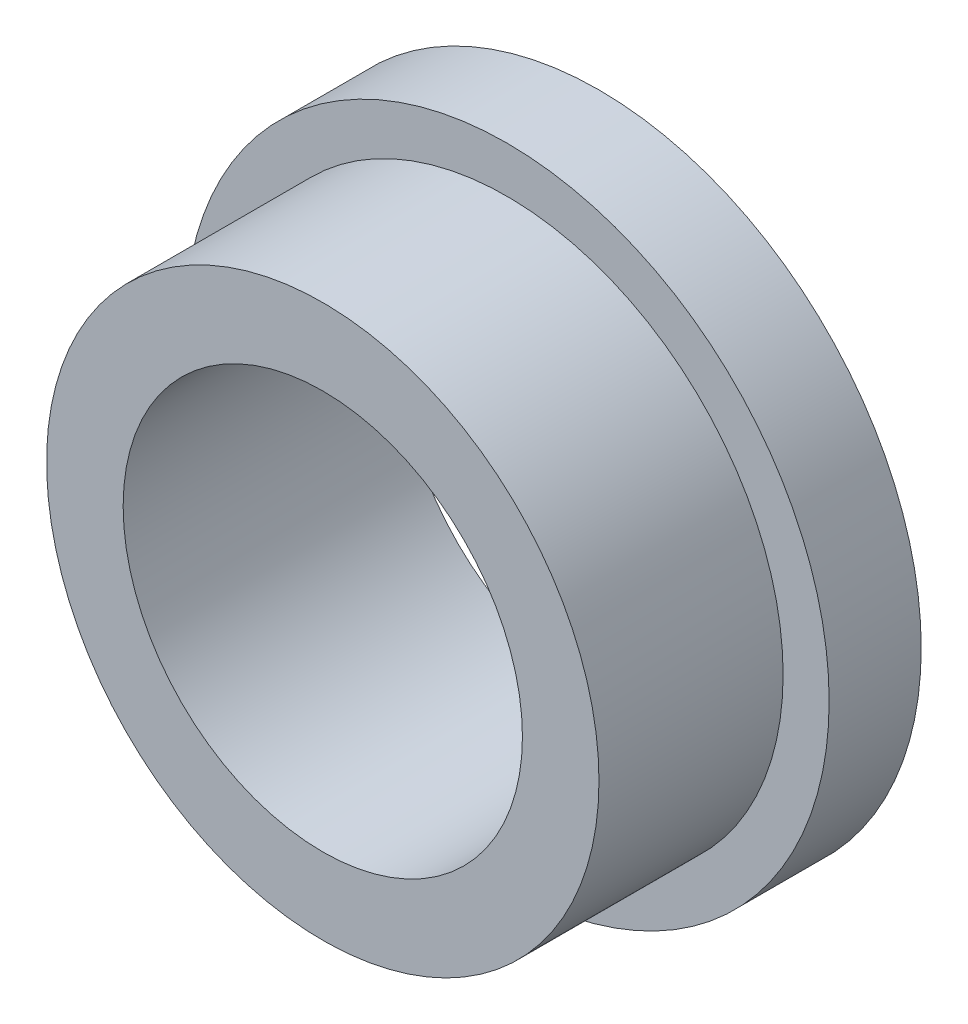
ISO-10303-21;
HEADER;
FILE_DESCRIPTION(('STEP AP214'),'2;1');
FILE_NAME('part.step','',(''),(''),'','','');
FILE_SCHEMA(('AUTOMOTIVE_DESIGN { 1 0 10303 214 1 1 1 1 }'));
ENDSEC;
DATA;
#1=APPLICATION_CONTEXT('core data for automotive mechanical design processes');
#2=APPLICATION_PROTOCOL_DEFINITION('international standard','automotive_design',2000,#1);
#3=PRODUCT_CONTEXT('',#1,'mechanical');
#4=PRODUCT('Part','Part','',(#3));
#5=PRODUCT_RELATED_PRODUCT_CATEGORY('part','',(#4));
#6=PRODUCT_DEFINITION_FORMATION('','',#4);
#7=PRODUCT_DEFINITION_CONTEXT('part definition',#1,'design');
#8=PRODUCT_DEFINITION('design','',#6,#7);
#9=PRODUCT_DEFINITION_SHAPE('','',#8);
#10=(LENGTH_UNIT() NAMED_UNIT(*) SI_UNIT(.MILLI.,.METRE.));
#11=(NAMED_UNIT(*) PLANE_ANGLE_UNIT() SI_UNIT($,.RADIAN.));
#12=(NAMED_UNIT(*) SI_UNIT($,.STERADIAN.) SOLID_ANGLE_UNIT());
#13=UNCERTAINTY_MEASURE_WITH_UNIT(LENGTH_MEASURE(1.E-05),#10,'distance_accuracy_value','');
#14=(GEOMETRIC_REPRESENTATION_CONTEXT(3) GLOBAL_UNCERTAINTY_ASSIGNED_CONTEXT((#13)) GLOBAL_UNIT_ASSIGNED_CONTEXT((#10,
#11,#12)) REPRESENTATION_CONTEXT('',''));
#15=CARTESIAN_POINT('',(0.,0.,0.));
#16=DIRECTION('',(0.,0.,1.));
#17=DIRECTION('',(1.,0.,0.));
#18=AXIS2_PLACEMENT_3D('',#15,#16,#17);
#19=CARTESIAN_POINT('',(0.,0.,6.35));
#20=DIRECTION('',(0.,0.,1.));
#21=DIRECTION('',(1.,0.,0.));
#22=AXIS2_PLACEMENT_3D('',#19,#20,#21);
#23=PLANE('',#22);
#24=CARTESIAN_POINT('',(0.,0.,6.35));
#25=DIRECTION('',(0.,0.,-1.));
#26=DIRECTION('',(-1.,0.,0.));
#27=AXIS2_PLACEMENT_3D('',#24,#25,#26);
#28=CIRCLE('',#27,6.885);
#29=CARTESIAN_POINT('',(6.885,0.,6.35));
#30=VERTEX_POINT('',#29);
#31=EDGE_CURVE('E26',#30,#30,#28,.T.);
#32=ORIENTED_EDGE('',*,*,#31,.T.);
#33=EDGE_LOOP('',(#32));
#34=FACE_BOUND('',#33,.T.);
#35=CARTESIAN_POINT('',(0.,0.,6.35));
#36=DIRECTION('',(0.,0.,1.));
#37=DIRECTION('',(-1.,0.,0.));
#38=AXIS2_PLACEMENT_3D('',#35,#36,#37);
#39=CIRCLE('',#38,9.525);
#40=CARTESIAN_POINT('',(9.525,0.,6.35));
#41=VERTEX_POINT('',#40);
#42=EDGE_CURVE('E10',#41,#41,#39,.T.);
#43=ORIENTED_EDGE('',*,*,#42,.T.);
#44=EDGE_LOOP('',(#43));
#45=FACE_BOUND('',#44,.T.);
#46=ADVANCED_FACE('F15',(#34,#45),#23,.T.);
#47=CARTESIAN_POINT('',(0.,0.,0.));
#48=DIRECTION('',(0.,0.,1.));
#49=DIRECTION('',(-1.,0.,0.));
#50=AXIS2_PLACEMENT_3D('',#47,#48,#49);
#51=CYLINDRICAL_SURFACE('',#50,9.525);
#52=CARTESIAN_POINT('',(0.,0.,0.));
#53=DIRECTION('',(0.,0.,-1.));
#54=DIRECTION('',(-1.,0.,0.));
#55=AXIS2_PLACEMENT_3D('',#52,#53,#54);
#56=CIRCLE('',#55,9.525);
#57=CARTESIAN_POINT('',(9.525,0.,0.));
#58=VERTEX_POINT('',#57);
#59=EDGE_CURVE('E65',#58,#58,#56,.T.);
#60=ORIENTED_EDGE('',*,*,#59,.F.);
#61=EDGE_LOOP('',(#60));
#62=FACE_BOUND('',#61,.T.);
#63=ORIENTED_EDGE('',*,*,#42,.F.);
#64=EDGE_LOOP('',(#63));
#65=FACE_BOUND('',#64,.T.);
#66=ADVANCED_FACE('F17',(#62,#65),#51,.T.);
#67=CARTESIAN_POINT('',(0.,0.,0.));
#68=DIRECTION('',(0.,0.,1.));
#69=DIRECTION('',(-1.,0.,0.));
#70=AXIS2_PLACEMENT_3D('',#67,#68,#69);
#71=CYLINDRICAL_SURFACE('',#70,6.885);
#72=ORIENTED_EDGE('',*,*,#31,.F.);
#73=EDGE_LOOP('',(#72));
#74=FACE_BOUND('',#73,.T.);
#75=CARTESIAN_POINT('',(0.,0.,-3.175));
#76=DIRECTION('',(0.,0.,1.));
#77=DIRECTION('',(1.,0.,0.));
#78=AXIS2_PLACEMENT_3D('',#75,#76,#77);
#79=CIRCLE('',#78,6.885);
#80=CARTESIAN_POINT('',(-6.885,0.,-3.175));
#81=VERTEX_POINT('',#80);
#82=EDGE_CURVE('E19',#81,#81,#79,.T.);
#83=ORIENTED_EDGE('',*,*,#82,.F.);
#84=EDGE_LOOP('',(#83));
#85=FACE_BOUND('',#84,.T.);
#86=ADVANCED_FACE('F92',(#74,#85),#71,.F.);
#87=CARTESIAN_POINT('',(0.,0.,-3.175));
#88=DIRECTION('',(0.,0.,1.));
#89=DIRECTION('',(1.,0.,0.));
#90=AXIS2_PLACEMENT_3D('',#87,#88,#89);
#91=PLANE('',#90);
#92=ORIENTED_EDGE('',*,*,#82,.T.);
#93=EDGE_LOOP('',(#92));
#94=FACE_BOUND('',#93,.T.);
#95=CARTESIAN_POINT('',(0.,0.,-3.175));
#96=DIRECTION('',(0.,0.,-1.));
#97=DIRECTION('',(1.,0.,0.));
#98=AXIS2_PLACEMENT_3D('',#95,#96,#97);
#99=CIRCLE('',#98,11.1125);
#100=CARTESIAN_POINT('',(-11.1125,0.,-3.175));
#101=VERTEX_POINT('',#100);
#102=EDGE_CURVE('E58',#101,#101,#99,.T.);
#103=ORIENTED_EDGE('',*,*,#102,.T.);
#104=EDGE_LOOP('',(#103));
#105=FACE_BOUND('',#104,.T.);
#106=ADVANCED_FACE('F54',(#94,#105),#91,.F.);
#107=CARTESIAN_POINT('',(0.,0.,0.));
#108=DIRECTION('',(0.,0.,-1.));
#109=DIRECTION('',(1.,0.,0.));
#110=AXIS2_PLACEMENT_3D('',#107,#108,#109);
#111=CYLINDRICAL_SURFACE('',#110,11.1125);
#112=CARTESIAN_POINT('',(0.,0.,0.));
#113=DIRECTION('',(0.,0.,1.));
#114=DIRECTION('',(1.,0.,0.));
#115=AXIS2_PLACEMENT_3D('',#112,#113,#114);
#116=CIRCLE('',#115,11.1125);
#117=CARTESIAN_POINT('',(-11.1125,0.,0.));
#118=VERTEX_POINT('',#117);
#119=EDGE_CURVE('E72',#118,#118,#116,.T.);
#120=ORIENTED_EDGE('',*,*,#119,.F.);
#121=EDGE_LOOP('',(#120));
#122=FACE_BOUND('',#121,.T.);
#123=ORIENTED_EDGE('',*,*,#102,.F.);
#124=EDGE_LOOP('',(#123));
#125=FACE_BOUND('',#124,.T.);
#126=ADVANCED_FACE('F81',(#122,#125),#111,.T.);
#127=CARTESIAN_POINT('',(0.,0.,0.));
#128=DIRECTION('',(0.,0.,1.));
#129=DIRECTION('',(1.,0.,0.));
#130=AXIS2_PLACEMENT_3D('',#127,#128,#129);
#131=PLANE('',#130);
#132=ORIENTED_EDGE('',*,*,#59,.T.);
#133=EDGE_LOOP('',(#132));
#134=FACE_BOUND('',#133,.T.);
#135=ORIENTED_EDGE('',*,*,#119,.T.);
#136=EDGE_LOOP('',(#135));
#137=FACE_BOUND('',#136,.T.);
#138=ADVANCED_FACE('F79',(#134,#137),#131,.T.);
#139=CLOSED_SHELL('',(#46,#66,#86,#106,#126,#138));
#140=MANIFOLD_SOLID_BREP('B1',#139);
#141=ADVANCED_BREP_SHAPE_REPRESENTATION('',(#18,#140),#14);
#142=SHAPE_DEFINITION_REPRESENTATION(#9,#141);
ENDSEC;
END-ISO-10303-21;
